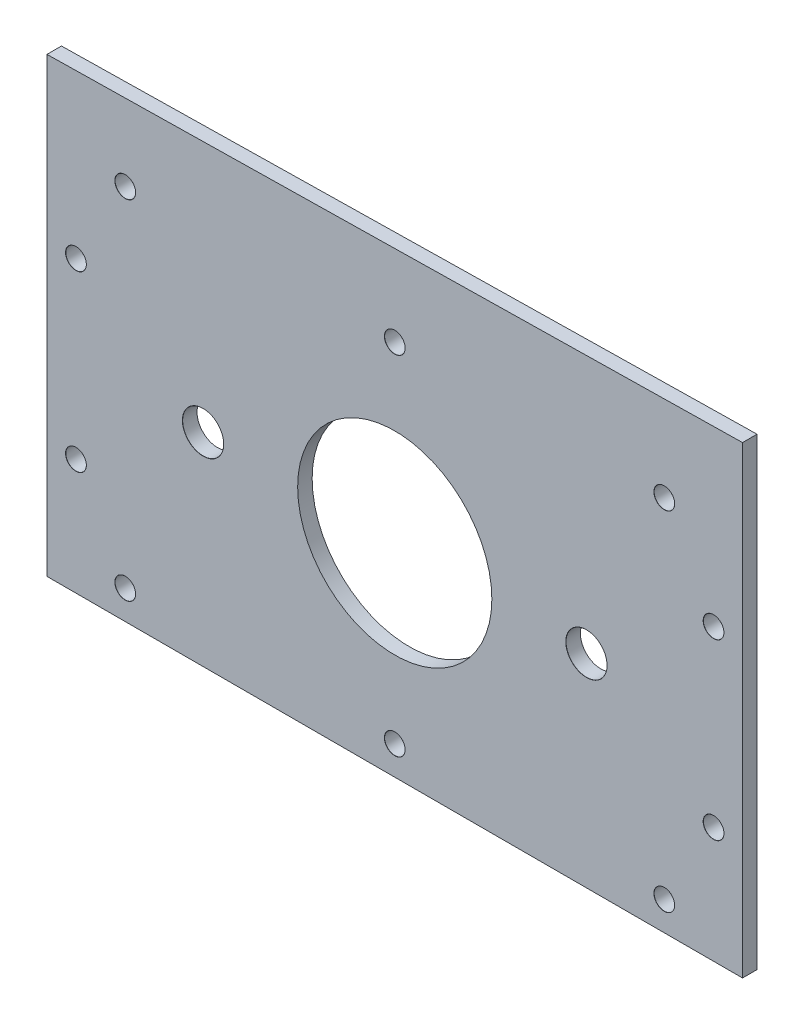
ISO-10303-21;
HEADER;
FILE_DESCRIPTION(('STEP AP214'),'2;1');
FILE_NAME('part.step','',(''),(''),'','','');
FILE_SCHEMA(('AUTOMOTIVE_DESIGN { 1 0 10303 214 1 1 1 1 }'));
ENDSEC;
DATA;
#1=APPLICATION_CONTEXT('core data for automotive mechanical design processes');
#2=APPLICATION_PROTOCOL_DEFINITION('international standard','automotive_design',2000,#1);
#3=PRODUCT_CONTEXT('',#1,'mechanical');
#4=PRODUCT('Part','Part','',(#3));
#5=PRODUCT_RELATED_PRODUCT_CATEGORY('part','',(#4));
#6=PRODUCT_DEFINITION_FORMATION('','',#4);
#7=PRODUCT_DEFINITION_CONTEXT('part definition',#1,'design');
#8=PRODUCT_DEFINITION('design','',#6,#7);
#9=PRODUCT_DEFINITION_SHAPE('','',#8);
#10=(LENGTH_UNIT() NAMED_UNIT(*) SI_UNIT(.MILLI.,.METRE.));
#11=(NAMED_UNIT(*) PLANE_ANGLE_UNIT() SI_UNIT($,.RADIAN.));
#12=(NAMED_UNIT(*) SI_UNIT($,.STERADIAN.) SOLID_ANGLE_UNIT());
#13=UNCERTAINTY_MEASURE_WITH_UNIT(LENGTH_MEASURE(1.E-05),#10,'distance_accuracy_value','');
#14=(GEOMETRIC_REPRESENTATION_CONTEXT(3) GLOBAL_UNCERTAINTY_ASSIGNED_CONTEXT((#13)) GLOBAL_UNIT_ASSIGNED_CONTEXT((#10,
#11,#12)) REPRESENTATION_CONTEXT('',''));
#15=CARTESIAN_POINT('',(0.,0.,0.));
#16=DIRECTION('',(0.,0.,1.));
#17=DIRECTION('',(1.,0.,0.));
#18=AXIS2_PLACEMENT_3D('',#15,#16,#17);
#19=CARTESIAN_POINT('',(76.2,44.45,3.175));
#20=DIRECTION('',(-1.,0.,0.));
#21=DIRECTION('',(0.,0.,1.));
#22=AXIS2_PLACEMENT_3D('',#19,#20,#21);
#23=PLANE('',#22);
#24=DIRECTION('',(0.,1.,0.));
#25=VECTOR('',#24,1.);
#26=CARTESIAN_POINT('',(76.2,44.45,0.));
#27=LINE('',#26,#25);
#28=CARTESIAN_POINT('',(76.2,-44.45,0.));
#29=VERTEX_POINT('',#28);
#30=CARTESIAN_POINT('',(76.2,57.15,0.));
#31=VERTEX_POINT('',#30);
#32=EDGE_CURVE('E73',#29,#31,#27,.T.);
#33=ORIENTED_EDGE('',*,*,#32,.T.);
#34=DIRECTION('',(0.,0.,-1.));
#35=VECTOR('',#34,1.);
#36=CARTESIAN_POINT('',(76.2,57.15,3.175));
#37=LINE('',#36,#35);
#38=CARTESIAN_POINT('',(76.2,57.15,3.175));
#39=VERTEX_POINT('',#38);
#40=EDGE_CURVE('E11',#39,#31,#37,.T.);
#41=ORIENTED_EDGE('',*,*,#40,.F.);
#42=DIRECTION('',(0.,1.,0.));
#43=VECTOR('',#42,1.);
#44=CARTESIAN_POINT('',(76.2,44.45,3.175));
#45=LINE('',#44,#43);
#46=CARTESIAN_POINT('',(76.2,-44.45,3.175));
#47=VERTEX_POINT('',#46);
#48=EDGE_CURVE('E78',#47,#39,#45,.T.);
#49=ORIENTED_EDGE('',*,*,#48,.F.);
#50=DIRECTION('',(0.,0.,-1.));
#51=VECTOR('',#50,1.);
#52=CARTESIAN_POINT('',(76.2,-44.45,3.175));
#53=LINE('',#52,#51);
#54=EDGE_CURVE('E94',#47,#29,#53,.T.);
#55=ORIENTED_EDGE('',*,*,#54,.T.);
#56=EDGE_LOOP('',(#33,#41,#49,#55));
#57=FACE_BOUND('',#56,.T.);
#58=ADVANCED_FACE('F34',(#57),#23,.F.);
#59=CARTESIAN_POINT('',(-76.2,54.61,3.175));
#60=DIRECTION('',(0.0166643523339933,-0.9998611400396,0.));
#61=DIRECTION('',(0.9998611400396,0.0166643523339933,0.));
#62=AXIS2_PLACEMENT_3D('',#59,#60,#61);
#63=PLANE('',#62);
#64=DIRECTION('',(-0.9998611400396,-0.0166643523339933,0.));
#65=VECTOR('',#64,1.);
#66=CARTESIAN_POINT('',(-76.2,54.61,0.));
#67=LINE('',#66,#65);
#68=CARTESIAN_POINT('',(-76.2,54.61,0.));
#69=VERTEX_POINT('',#68);
#70=EDGE_CURVE('E90',#31,#69,#67,.T.);
#71=ORIENTED_EDGE('',*,*,#70,.T.);
#72=DIRECTION('',(0.,0.,-1.));
#73=VECTOR('',#72,1.);
#74=CARTESIAN_POINT('',(-76.2,54.61,3.175));
#75=LINE('',#74,#73);
#76=CARTESIAN_POINT('',(-76.2,54.61,3.175));
#77=VERTEX_POINT('',#76);
#78=EDGE_CURVE('E42',#77,#69,#75,.T.);
#79=ORIENTED_EDGE('',*,*,#78,.F.);
#80=DIRECTION('',(-0.9998611400396,-0.0166643523339933,0.));
#81=VECTOR('',#80,1.);
#82=CARTESIAN_POINT('',(-76.2,54.61,3.175));
#83=LINE('',#82,#81);
#84=EDGE_CURVE('E81',#39,#77,#83,.T.);
#85=ORIENTED_EDGE('',*,*,#84,.F.);
#86=ORIENTED_EDGE('',*,*,#40,.T.);
#87=EDGE_LOOP('',(#71,#79,#85,#86));
#88=FACE_BOUND('',#87,.T.);
#89=ADVANCED_FACE('F89',(#88),#63,.F.);
#90=CARTESIAN_POINT('',(-76.2,44.45,3.175));
#91=DIRECTION('',(1.,0.,0.));
#92=DIRECTION('',(0.,0.,-1.));
#93=AXIS2_PLACEMENT_3D('',#90,#91,#92);
#94=PLANE('',#93);
#95=DIRECTION('',(0.,-1.,0.));
#96=VECTOR('',#95,1.);
#97=CARTESIAN_POINT('',(-76.2,44.45,0.));
#98=LINE('',#97,#96);
#99=CARTESIAN_POINT('',(-76.2,-44.45,0.));
#100=VERTEX_POINT('',#99);
#101=EDGE_CURVE('E66',#69,#100,#98,.T.);
#102=ORIENTED_EDGE('',*,*,#101,.T.);
#103=DIRECTION('',(0.,0.,-1.));
#104=VECTOR('',#103,1.);
#105=CARTESIAN_POINT('',(-76.2,-44.45,3.175));
#106=LINE('',#105,#104);
#107=CARTESIAN_POINT('',(-76.2,-44.45,3.175));
#108=VERTEX_POINT('',#107);
#109=EDGE_CURVE('E91',#108,#100,#106,.T.);
#110=ORIENTED_EDGE('',*,*,#109,.F.);
#111=DIRECTION('',(0.,-1.,0.));
#112=VECTOR('',#111,1.);
#113=CARTESIAN_POINT('',(-76.2,54.61,3.175));
#114=LINE('',#113,#112);
#115=EDGE_CURVE('E85',#77,#108,#114,.T.);
#116=ORIENTED_EDGE('',*,*,#115,.F.);
#117=ORIENTED_EDGE('',*,*,#78,.T.);
#118=EDGE_LOOP('',(#102,#110,#116,#117));
#119=FACE_BOUND('',#118,.T.);
#120=ADVANCED_FACE('F92',(#119),#94,.F.);
#121=CARTESIAN_POINT('',(-76.2,-44.45,3.175));
#122=DIRECTION('',(0.,1.,0.));
#123=DIRECTION('',(0.,0.,1.));
#124=AXIS2_PLACEMENT_3D('',#121,#122,#123);
#125=PLANE('',#124);
#126=DIRECTION('',(1.,0.,0.));
#127=VECTOR('',#126,1.);
#128=CARTESIAN_POINT('',(-76.2,-44.45,0.));
#129=LINE('',#128,#127);
#130=EDGE_CURVE('E102',#100,#29,#129,.T.);
#131=ORIENTED_EDGE('',*,*,#130,.T.);
#132=ORIENTED_EDGE('',*,*,#54,.F.);
#133=DIRECTION('',(1.,0.,0.));
#134=VECTOR('',#133,1.);
#135=CARTESIAN_POINT('',(-76.2,-44.45,3.175));
#136=LINE('',#135,#134);
#137=EDGE_CURVE('E50',#108,#47,#136,.T.);
#138=ORIENTED_EDGE('',*,*,#137,.F.);
#139=ORIENTED_EDGE('',*,*,#109,.T.);
#140=EDGE_LOOP('',(#131,#132,#138,#139));
#141=FACE_BOUND('',#140,.T.);
#142=ADVANCED_FACE('F107',(#141),#125,.F.);
#143=CARTESIAN_POINT('',(0.,0.,3.175));
#144=DIRECTION('',(0.,0.,1.));
#145=DIRECTION('',(1.,0.,0.));
#146=AXIS2_PLACEMENT_3D('',#143,#144,#145);
#147=PLANE('',#146);
#148=CARTESIAN_POINT('',(0.,0.,3.175));
#149=DIRECTION('',(0.,0.,1.));
#150=DIRECTION('',(1.,0.,0.));
#151=AXIS2_PLACEMENT_3D('',#148,#149,#150);
#152=CIRCLE('',#151,21.275);
#153=CARTESIAN_POINT('',(21.275,0.,3.175));
#154=VERTEX_POINT('',#153);
#155=EDGE_CURVE('E239',#154,#154,#152,.T.);
#156=ORIENTED_EDGE('',*,*,#155,.F.);
#157=EDGE_LOOP('',(#156));
#158=FACE_BOUND('',#157,.T.);
#159=CARTESIAN_POINT('',(-42.,0.,3.175));
#160=DIRECTION('',(0.,0.,1.));
#161=DIRECTION('',(1.,0.,0.));
#162=AXIS2_PLACEMENT_3D('',#159,#160,#161);
#163=CIRCLE('',#162,4.525);
#164=CARTESIAN_POINT('',(-37.475,0.,3.175));
#165=VERTEX_POINT('',#164);
#166=EDGE_CURVE('E235',#165,#165,#163,.T.);
#167=ORIENTED_EDGE('',*,*,#166,.F.);
#168=EDGE_LOOP('',(#167));
#169=FACE_BOUND('',#168,.T.);
#170=CARTESIAN_POINT('',(42.,0.,3.175));
#171=DIRECTION('',(0.,0.,1.));
#172=DIRECTION('',(1.,0.,0.));
#173=AXIS2_PLACEMENT_3D('',#170,#171,#172);
#174=CIRCLE('',#173,4.525);
#175=CARTESIAN_POINT('',(46.525,0.,3.175));
#176=VERTEX_POINT('',#175);
#177=EDGE_CURVE('E226',#176,#176,#174,.T.);
#178=ORIENTED_EDGE('',*,*,#177,.F.);
#179=EDGE_LOOP('',(#178));
#180=FACE_BOUND('',#179,.T.);
#181=CARTESIAN_POINT('',(-59.055,38.1,3.175));
#182=DIRECTION('',(0.,0.,1.));
#183=DIRECTION('',(1.,0.,0.));
#184=AXIS2_PLACEMENT_3D('',#181,#182,#183);
#185=CIRCLE('',#184,2.275);
#186=CARTESIAN_POINT('',(-56.78,38.1,3.175));
#187=VERTEX_POINT('',#186);
#188=EDGE_CURVE('E217',#187,#187,#185,.T.);
#189=ORIENTED_EDGE('',*,*,#188,.F.);
#190=EDGE_LOOP('',(#189));
#191=FACE_BOUND('',#190,.T.);
#192=CARTESIAN_POINT('',(0.,38.1,3.175));
#193=DIRECTION('',(0.,0.,1.));
#194=DIRECTION('',(1.,0.,0.));
#195=AXIS2_PLACEMENT_3D('',#192,#193,#194);
#196=CIRCLE('',#195,2.275);
#197=CARTESIAN_POINT('',(2.275,38.1,3.175));
#198=VERTEX_POINT('',#197);
#199=EDGE_CURVE('E208',#198,#198,#196,.T.);
#200=ORIENTED_EDGE('',*,*,#199,.F.);
#201=EDGE_LOOP('',(#200));
#202=FACE_BOUND('',#201,.T.);
#203=CARTESIAN_POINT('',(59.055,38.1,3.175));
#204=DIRECTION('',(0.,0.,1.));
#205=DIRECTION('',(1.,0.,0.));
#206=AXIS2_PLACEMENT_3D('',#203,#204,#205);
#207=CIRCLE('',#206,2.275);
#208=CARTESIAN_POINT('',(61.33,38.1,3.175));
#209=VERTEX_POINT('',#208);
#210=EDGE_CURVE('E199',#209,#209,#207,.T.);
#211=ORIENTED_EDGE('',*,*,#210,.F.);
#212=EDGE_LOOP('',(#211));
#213=FACE_BOUND('',#212,.T.);
#214=CARTESIAN_POINT('',(69.85,19.05,3.175));
#215=DIRECTION('',(0.,0.,1.));
#216=DIRECTION('',(1.,0.,0.));
#217=AXIS2_PLACEMENT_3D('',#214,#215,#216);
#218=CIRCLE('',#217,2.275);
#219=CARTESIAN_POINT('',(72.125,19.05,3.175));
#220=VERTEX_POINT('',#219);
#221=EDGE_CURVE('E190',#220,#220,#218,.T.);
#222=ORIENTED_EDGE('',*,*,#221,.F.);
#223=EDGE_LOOP('',(#222));
#224=FACE_BOUND('',#223,.T.);
#225=CARTESIAN_POINT('',(69.85,-19.05,3.175));
#226=DIRECTION('',(0.,0.,1.));
#227=DIRECTION('',(1.,0.,0.));
#228=AXIS2_PLACEMENT_3D('',#225,#226,#227);
#229=CIRCLE('',#228,2.275);
#230=CARTESIAN_POINT('',(72.125,-19.05,3.175));
#231=VERTEX_POINT('',#230);
#232=EDGE_CURVE('E181',#231,#231,#229,.T.);
#233=ORIENTED_EDGE('',*,*,#232,.F.);
#234=EDGE_LOOP('',(#233));
#235=FACE_BOUND('',#234,.T.);
#236=CARTESIAN_POINT('',(59.055,-38.1,3.175));
#237=DIRECTION('',(0.,0.,1.));
#238=DIRECTION('',(1.,0.,0.));
#239=AXIS2_PLACEMENT_3D('',#236,#237,#238);
#240=CIRCLE('',#239,2.275);
#241=CARTESIAN_POINT('',(61.33,-38.1,3.175));
#242=VERTEX_POINT('',#241);
#243=EDGE_CURVE('E172',#242,#242,#240,.T.);
#244=ORIENTED_EDGE('',*,*,#243,.F.);
#245=EDGE_LOOP('',(#244));
#246=FACE_BOUND('',#245,.T.);
#247=CARTESIAN_POINT('',(0.,-38.1,3.175));
#248=DIRECTION('',(0.,0.,1.));
#249=DIRECTION('',(1.,0.,0.));
#250=AXIS2_PLACEMENT_3D('',#247,#248,#249);
#251=CIRCLE('',#250,2.275);
#252=CARTESIAN_POINT('',(2.27500000000003,-38.1,3.175));
#253=VERTEX_POINT('',#252);
#254=EDGE_CURVE('E163',#253,#253,#251,.T.);
#255=ORIENTED_EDGE('',*,*,#254,.F.);
#256=EDGE_LOOP('',(#255));
#257=FACE_BOUND('',#256,.T.);
#258=CARTESIAN_POINT('',(-59.055,-38.1,3.175));
#259=DIRECTION('',(0.,0.,1.));
#260=DIRECTION('',(1.,0.,0.));
#261=AXIS2_PLACEMENT_3D('',#258,#259,#260);
#262=CIRCLE('',#261,2.275);
#263=CARTESIAN_POINT('',(-56.78,-38.1,3.175));
#264=VERTEX_POINT('',#263);
#265=EDGE_CURVE('E154',#264,#264,#262,.T.);
#266=ORIENTED_EDGE('',*,*,#265,.F.);
#267=EDGE_LOOP('',(#266));
#268=FACE_BOUND('',#267,.T.);
#269=CARTESIAN_POINT('',(-69.85,-19.05,3.175));
#270=DIRECTION('',(0.,0.,1.));
#271=DIRECTION('',(1.,0.,0.));
#272=AXIS2_PLACEMENT_3D('',#269,#270,#271);
#273=CIRCLE('',#272,2.275);
#274=CARTESIAN_POINT('',(-67.575,-19.05,3.175));
#275=VERTEX_POINT('',#274);
#276=EDGE_CURVE('E145',#275,#275,#273,.T.);
#277=ORIENTED_EDGE('',*,*,#276,.F.);
#278=EDGE_LOOP('',(#277));
#279=FACE_BOUND('',#278,.T.);
#280=CARTESIAN_POINT('',(-69.85,19.05,3.175));
#281=DIRECTION('',(0.,0.,1.));
#282=DIRECTION('',(1.,0.,0.));
#283=AXIS2_PLACEMENT_3D('',#280,#281,#282);
#284=CIRCLE('',#283,2.275);
#285=CARTESIAN_POINT('',(-67.575,19.05,3.175));
#286=VERTEX_POINT('',#285);
#287=EDGE_CURVE('E136',#286,#286,#284,.T.);
#288=ORIENTED_EDGE('',*,*,#287,.F.);
#289=EDGE_LOOP('',(#288));
#290=FACE_BOUND('',#289,.T.);
#291=ORIENTED_EDGE('',*,*,#48,.T.);
#292=ORIENTED_EDGE('',*,*,#84,.T.);
#293=ORIENTED_EDGE('',*,*,#115,.T.);
#294=ORIENTED_EDGE('',*,*,#137,.T.);
#295=EDGE_LOOP('',(#291,#292,#293,#294));
#296=FACE_BOUND('',#295,.T.);
#297=ADVANCED_FACE('F83',(#158,#169,#180,#191,#202,#213,#224,#235,#246,#257,#268,#279,#290,
#296),#147,.T.);
#298=CARTESIAN_POINT('',(0.,0.,0.));
#299=DIRECTION('',(0.,0.,1.));
#300=DIRECTION('',(1.,0.,0.));
#301=AXIS2_PLACEMENT_3D('',#298,#299,#300);
#302=PLANE('',#301);
#303=CARTESIAN_POINT('',(0.,0.,0.));
#304=DIRECTION('',(0.,0.,1.));
#305=DIRECTION('',(1.,0.,0.));
#306=AXIS2_PLACEMENT_3D('',#303,#304,#305);
#307=CIRCLE('',#306,21.275);
#308=CARTESIAN_POINT('',(21.275,0.,0.));
#309=VERTEX_POINT('',#308);
#310=EDGE_CURVE('E238',#309,#309,#307,.T.);
#311=ORIENTED_EDGE('',*,*,#310,.T.);
#312=EDGE_LOOP('',(#311));
#313=FACE_BOUND('',#312,.T.);
#314=CARTESIAN_POINT('',(-42.,0.,0.));
#315=DIRECTION('',(0.,0.,1.));
#316=DIRECTION('',(1.,0.,0.));
#317=AXIS2_PLACEMENT_3D('',#314,#315,#316);
#318=CIRCLE('',#317,4.5);
#319=CARTESIAN_POINT('',(-37.5,0.,0.));
#320=VERTEX_POINT('',#319);
#321=EDGE_CURVE('E229',#320,#320,#318,.T.);
#322=ORIENTED_EDGE('',*,*,#321,.T.);
#323=EDGE_LOOP('',(#322));
#324=FACE_BOUND('',#323,.T.);
#325=CARTESIAN_POINT('',(42.,0.,0.));
#326=DIRECTION('',(0.,0.,1.));
#327=DIRECTION('',(1.,0.,0.));
#328=AXIS2_PLACEMENT_3D('',#325,#326,#327);
#329=CIRCLE('',#328,4.5);
#330=CARTESIAN_POINT('',(46.5,0.,0.));
#331=VERTEX_POINT('',#330);
#332=EDGE_CURVE('E220',#331,#331,#329,.T.);
#333=ORIENTED_EDGE('',*,*,#332,.T.);
#334=EDGE_LOOP('',(#333));
#335=FACE_BOUND('',#334,.T.);
#336=CARTESIAN_POINT('',(-59.055,38.1,0.));
#337=DIRECTION('',(0.,0.,1.));
#338=DIRECTION('',(1.,0.,0.));
#339=AXIS2_PLACEMENT_3D('',#336,#337,#338);
#340=CIRCLE('',#339,2.25);
#341=CARTESIAN_POINT('',(-56.805,38.1,0.));
#342=VERTEX_POINT('',#341);
#343=EDGE_CURVE('E211',#342,#342,#340,.T.);
#344=ORIENTED_EDGE('',*,*,#343,.T.);
#345=EDGE_LOOP('',(#344));
#346=FACE_BOUND('',#345,.T.);
#347=CARTESIAN_POINT('',(0.,38.1,0.));
#348=DIRECTION('',(0.,0.,1.));
#349=DIRECTION('',(1.,0.,0.));
#350=AXIS2_PLACEMENT_3D('',#347,#348,#349);
#351=CIRCLE('',#350,2.25);
#352=CARTESIAN_POINT('',(2.25,38.1,0.));
#353=VERTEX_POINT('',#352);
#354=EDGE_CURVE('E202',#353,#353,#351,.T.);
#355=ORIENTED_EDGE('',*,*,#354,.T.);
#356=EDGE_LOOP('',(#355));
#357=FACE_BOUND('',#356,.T.);
#358=CARTESIAN_POINT('',(59.055,38.1,0.));
#359=DIRECTION('',(0.,0.,1.));
#360=DIRECTION('',(1.,0.,0.));
#361=AXIS2_PLACEMENT_3D('',#358,#359,#360);
#362=CIRCLE('',#361,2.25);
#363=CARTESIAN_POINT('',(61.305,38.1,0.));
#364=VERTEX_POINT('',#363);
#365=EDGE_CURVE('E193',#364,#364,#362,.T.);
#366=ORIENTED_EDGE('',*,*,#365,.T.);
#367=EDGE_LOOP('',(#366));
#368=FACE_BOUND('',#367,.T.);
#369=CARTESIAN_POINT('',(69.85,19.05,0.));
#370=DIRECTION('',(0.,0.,1.));
#371=DIRECTION('',(1.,0.,0.));
#372=AXIS2_PLACEMENT_3D('',#369,#370,#371);
#373=CIRCLE('',#372,2.25);
#374=CARTESIAN_POINT('',(72.1,19.05,0.));
#375=VERTEX_POINT('',#374);
#376=EDGE_CURVE('E184',#375,#375,#373,.T.);
#377=ORIENTED_EDGE('',*,*,#376,.T.);
#378=EDGE_LOOP('',(#377));
#379=FACE_BOUND('',#378,.T.);
#380=CARTESIAN_POINT('',(69.85,-19.05,0.));
#381=DIRECTION('',(0.,0.,1.));
#382=DIRECTION('',(1.,0.,0.));
#383=AXIS2_PLACEMENT_3D('',#380,#381,#382);
#384=CIRCLE('',#383,2.25);
#385=CARTESIAN_POINT('',(72.1,-19.05,0.));
#386=VERTEX_POINT('',#385);
#387=EDGE_CURVE('E175',#386,#386,#384,.T.);
#388=ORIENTED_EDGE('',*,*,#387,.T.);
#389=EDGE_LOOP('',(#388));
#390=FACE_BOUND('',#389,.T.);
#391=CARTESIAN_POINT('',(59.055,-38.1,0.));
#392=DIRECTION('',(0.,0.,1.));
#393=DIRECTION('',(1.,0.,0.));
#394=AXIS2_PLACEMENT_3D('',#391,#392,#393);
#395=CIRCLE('',#394,2.25);
#396=CARTESIAN_POINT('',(61.305,-38.1,0.));
#397=VERTEX_POINT('',#396);
#398=EDGE_CURVE('E166',#397,#397,#395,.T.);
#399=ORIENTED_EDGE('',*,*,#398,.T.);
#400=EDGE_LOOP('',(#399));
#401=FACE_BOUND('',#400,.T.);
#402=CARTESIAN_POINT('',(0.,-38.1,0.));
#403=DIRECTION('',(0.,0.,1.));
#404=DIRECTION('',(1.,0.,0.));
#405=AXIS2_PLACEMENT_3D('',#402,#403,#404);
#406=CIRCLE('',#405,2.25);
#407=CARTESIAN_POINT('',(2.25000000000003,-38.1,0.));
#408=VERTEX_POINT('',#407);
#409=EDGE_CURVE('E157',#408,#408,#406,.T.);
#410=ORIENTED_EDGE('',*,*,#409,.T.);
#411=EDGE_LOOP('',(#410));
#412=FACE_BOUND('',#411,.T.);
#413=CARTESIAN_POINT('',(-59.055,-38.1,0.));
#414=DIRECTION('',(0.,0.,1.));
#415=DIRECTION('',(1.,0.,0.));
#416=AXIS2_PLACEMENT_3D('',#413,#414,#415);
#417=CIRCLE('',#416,2.25);
#418=CARTESIAN_POINT('',(-56.805,-38.1,0.));
#419=VERTEX_POINT('',#418);
#420=EDGE_CURVE('E148',#419,#419,#417,.T.);
#421=ORIENTED_EDGE('',*,*,#420,.T.);
#422=EDGE_LOOP('',(#421));
#423=FACE_BOUND('',#422,.T.);
#424=CARTESIAN_POINT('',(-69.85,-19.05,0.));
#425=DIRECTION('',(0.,0.,1.));
#426=DIRECTION('',(1.,0.,0.));
#427=AXIS2_PLACEMENT_3D('',#424,#425,#426);
#428=CIRCLE('',#427,2.25);
#429=CARTESIAN_POINT('',(-67.6,-19.05,0.));
#430=VERTEX_POINT('',#429);
#431=EDGE_CURVE('E139',#430,#430,#428,.T.);
#432=ORIENTED_EDGE('',*,*,#431,.T.);
#433=EDGE_LOOP('',(#432));
#434=FACE_BOUND('',#433,.T.);
#435=CARTESIAN_POINT('',(-69.85,19.05,0.));
#436=DIRECTION('',(0.,0.,1.));
#437=DIRECTION('',(1.,0.,0.));
#438=AXIS2_PLACEMENT_3D('',#435,#436,#437);
#439=CIRCLE('',#438,2.25);
#440=CARTESIAN_POINT('',(-67.6,19.05,0.));
#441=VERTEX_POINT('',#440);
#442=EDGE_CURVE('E99',#441,#441,#439,.T.);
#443=ORIENTED_EDGE('',*,*,#442,.T.);
#444=EDGE_LOOP('',(#443));
#445=FACE_BOUND('',#444,.T.);
#446=ORIENTED_EDGE('',*,*,#32,.F.);
#447=ORIENTED_EDGE('',*,*,#130,.F.);
#448=ORIENTED_EDGE('',*,*,#101,.F.);
#449=ORIENTED_EDGE('',*,*,#70,.F.);
#450=EDGE_LOOP('',(#446,#447,#448,#449));
#451=FACE_BOUND('',#450,.T.);
#452=ADVANCED_FACE('F108',(#313,#324,#335,#346,#357,#368,#379,#390,#401,#412,#423,#434,#445,
#451),#302,.F.);
#453=CARTESIAN_POINT('',(-69.85,19.05,3.175));
#454=DIRECTION('',(0.,0.,1.));
#455=DIRECTION('',(1.,0.,0.));
#456=AXIS2_PLACEMENT_3D('',#453,#454,#455);
#457=CYLINDRICAL_SURFACE('',#456,2.25);
#458=ORIENTED_EDGE('',*,*,#442,.F.);
#459=EDGE_LOOP('',(#458));
#460=FACE_BOUND('',#459,.T.);
#461=CARTESIAN_POINT('',(-69.85,19.05,3.15));
#462=DIRECTION('',(0.,0.,1.));
#463=DIRECTION('',(1.,0.,0.));
#464=AXIS2_PLACEMENT_3D('',#461,#462,#463);
#465=CIRCLE('',#464,2.25);
#466=CARTESIAN_POINT('',(-67.6,19.05,3.15));
#467=VERTEX_POINT('',#466);
#468=EDGE_CURVE('E133',#467,#467,#465,.T.);
#469=ORIENTED_EDGE('',*,*,#468,.T.);
#470=EDGE_LOOP('',(#469));
#471=FACE_BOUND('',#470,.T.);
#472=ADVANCED_FACE('F110',(#460,#471),#457,.F.);
#473=CARTESIAN_POINT('',(-69.85,19.05,3.175));
#474=DIRECTION('',(0.,0.,1.));
#475=DIRECTION('',(1.,0.,0.));
#476=AXIS2_PLACEMENT_3D('',#473,#474,#475);
#477=CONICAL_SURFACE('',#476,2.275,0.785398163397353);
#478=ORIENTED_EDGE('',*,*,#468,.F.);
#479=EDGE_LOOP('',(#478));
#480=FACE_BOUND('',#479,.T.);
#481=ORIENTED_EDGE('',*,*,#287,.T.);
#482=EDGE_LOOP('',(#481));
#483=FACE_BOUND('',#482,.T.);
#484=ADVANCED_FACE('F117',(#480,#483),#477,.F.);
#485=CARTESIAN_POINT('',(-69.85,-19.05,3.175));
#486=DIRECTION('',(0.,0.,1.));
#487=DIRECTION('',(1.,0.,0.));
#488=AXIS2_PLACEMENT_3D('',#485,#486,#487);
#489=CYLINDRICAL_SURFACE('',#488,2.25);
#490=ORIENTED_EDGE('',*,*,#431,.F.);
#491=EDGE_LOOP('',(#490));
#492=FACE_BOUND('',#491,.T.);
#493=CARTESIAN_POINT('',(-69.85,-19.05,3.15));
#494=DIRECTION('',(0.,0.,1.));
#495=DIRECTION('',(1.,0.,0.));
#496=AXIS2_PLACEMENT_3D('',#493,#494,#495);
#497=CIRCLE('',#496,2.25);
#498=CARTESIAN_POINT('',(-67.6,-19.05,3.15));
#499=VERTEX_POINT('',#498);
#500=EDGE_CURVE('E142',#499,#499,#497,.T.);
#501=ORIENTED_EDGE('',*,*,#500,.T.);
#502=EDGE_LOOP('',(#501));
#503=FACE_BOUND('',#502,.T.);
#504=ADVANCED_FACE('F276',(#492,#503),#489,.F.);
#505=CARTESIAN_POINT('',(-69.85,-19.05,3.175));
#506=DIRECTION('',(0.,0.,1.));
#507=DIRECTION('',(1.,0.,0.));
#508=AXIS2_PLACEMENT_3D('',#505,#506,#507);
#509=CONICAL_SURFACE('',#508,2.275,0.785398163397353);
#510=ORIENTED_EDGE('',*,*,#500,.F.);
#511=EDGE_LOOP('',(#510));
#512=FACE_BOUND('',#511,.T.);
#513=ORIENTED_EDGE('',*,*,#276,.T.);
#514=EDGE_LOOP('',(#513));
#515=FACE_BOUND('',#514,.T.);
#516=ADVANCED_FACE('F282',(#512,#515),#509,.F.);
#517=CARTESIAN_POINT('',(-59.055,-38.1,3.175));
#518=DIRECTION('',(0.,0.,1.));
#519=DIRECTION('',(1.,0.,0.));
#520=AXIS2_PLACEMENT_3D('',#517,#518,#519);
#521=CYLINDRICAL_SURFACE('',#520,2.25);
#522=ORIENTED_EDGE('',*,*,#420,.F.);
#523=EDGE_LOOP('',(#522));
#524=FACE_BOUND('',#523,.T.);
#525=CARTESIAN_POINT('',(-59.055,-38.1,3.15));
#526=DIRECTION('',(0.,0.,1.));
#527=DIRECTION('',(1.,0.,0.));
#528=AXIS2_PLACEMENT_3D('',#525,#526,#527);
#529=CIRCLE('',#528,2.25);
#530=CARTESIAN_POINT('',(-56.805,-38.1,3.15));
#531=VERTEX_POINT('',#530);
#532=EDGE_CURVE('E151',#531,#531,#529,.T.);
#533=ORIENTED_EDGE('',*,*,#532,.T.);
#534=EDGE_LOOP('',(#533));
#535=FACE_BOUND('',#534,.T.);
#536=ADVANCED_FACE('F289',(#524,#535),#521,.F.);
#537=CARTESIAN_POINT('',(-59.055,-38.1,3.175));
#538=DIRECTION('',(0.,0.,1.));
#539=DIRECTION('',(1.,0.,0.));
#540=AXIS2_PLACEMENT_3D('',#537,#538,#539);
#541=CONICAL_SURFACE('',#540,2.275,0.785398163397353);
#542=ORIENTED_EDGE('',*,*,#532,.F.);
#543=EDGE_LOOP('',(#542));
#544=FACE_BOUND('',#543,.T.);
#545=ORIENTED_EDGE('',*,*,#265,.T.);
#546=EDGE_LOOP('',(#545));
#547=FACE_BOUND('',#546,.T.);
#548=ADVANCED_FACE('F293',(#544,#547),#541,.F.);
#549=CARTESIAN_POINT('',(0.,-38.1,3.175));
#550=DIRECTION('',(0.,0.,1.));
#551=DIRECTION('',(1.,0.,0.));
#552=AXIS2_PLACEMENT_3D('',#549,#550,#551);
#553=CYLINDRICAL_SURFACE('',#552,2.25);
#554=ORIENTED_EDGE('',*,*,#409,.F.);
#555=EDGE_LOOP('',(#554));
#556=FACE_BOUND('',#555,.T.);
#557=CARTESIAN_POINT('',(0.,-38.1,3.15));
#558=DIRECTION('',(0.,0.,1.));
#559=DIRECTION('',(1.,0.,0.));
#560=AXIS2_PLACEMENT_3D('',#557,#558,#559);
#561=CIRCLE('',#560,2.25);
#562=CARTESIAN_POINT('',(2.25000000000003,-38.1,3.15));
#563=VERTEX_POINT('',#562);
#564=EDGE_CURVE('E160',#563,#563,#561,.T.);
#565=ORIENTED_EDGE('',*,*,#564,.T.);
#566=EDGE_LOOP('',(#565));
#567=FACE_BOUND('',#566,.T.);
#568=ADVANCED_FACE('F297',(#556,#567),#553,.F.);
#569=CARTESIAN_POINT('',(0.,-38.1,3.175));
#570=DIRECTION('',(0.,0.,1.));
#571=DIRECTION('',(1.,0.,0.));
#572=AXIS2_PLACEMENT_3D('',#569,#570,#571);
#573=CONICAL_SURFACE('',#572,2.275,0.785398163397396);
#574=ORIENTED_EDGE('',*,*,#564,.F.);
#575=EDGE_LOOP('',(#574));
#576=FACE_BOUND('',#575,.T.);
#577=ORIENTED_EDGE('',*,*,#254,.T.);
#578=EDGE_LOOP('',(#577));
#579=FACE_BOUND('',#578,.T.);
#580=ADVANCED_FACE('F301',(#576,#579),#573,.F.);
#581=CARTESIAN_POINT('',(59.055,-38.1,3.175));
#582=DIRECTION('',(0.,0.,1.));
#583=DIRECTION('',(1.,0.,0.));
#584=AXIS2_PLACEMENT_3D('',#581,#582,#583);
#585=CYLINDRICAL_SURFACE('',#584,2.25);
#586=ORIENTED_EDGE('',*,*,#398,.F.);
#587=EDGE_LOOP('',(#586));
#588=FACE_BOUND('',#587,.T.);
#589=CARTESIAN_POINT('',(59.055,-38.1,3.15));
#590=DIRECTION('',(0.,0.,1.));
#591=DIRECTION('',(1.,0.,0.));
#592=AXIS2_PLACEMENT_3D('',#589,#590,#591);
#593=CIRCLE('',#592,2.25);
#594=CARTESIAN_POINT('',(61.305,-38.1,3.15));
#595=VERTEX_POINT('',#594);
#596=EDGE_CURVE('E169',#595,#595,#593,.T.);
#597=ORIENTED_EDGE('',*,*,#596,.T.);
#598=EDGE_LOOP('',(#597));
#599=FACE_BOUND('',#598,.T.);
#600=ADVANCED_FACE('F305',(#588,#599),#585,.F.);
#601=CARTESIAN_POINT('',(59.055,-38.1,3.175));
#602=DIRECTION('',(0.,0.,1.));
#603=DIRECTION('',(1.,0.,0.));
#604=AXIS2_PLACEMENT_3D('',#601,#602,#603);
#605=CONICAL_SURFACE('',#604,2.275,0.785398163397353);
#606=ORIENTED_EDGE('',*,*,#596,.F.);
#607=EDGE_LOOP('',(#606));
#608=FACE_BOUND('',#607,.T.);
#609=ORIENTED_EDGE('',*,*,#243,.T.);
#610=EDGE_LOOP('',(#609));
#611=FACE_BOUND('',#610,.T.);
#612=ADVANCED_FACE('F309',(#608,#611),#605,.F.);
#613=CARTESIAN_POINT('',(69.85,-19.05,3.175));
#614=DIRECTION('',(0.,0.,1.));
#615=DIRECTION('',(1.,0.,0.));
#616=AXIS2_PLACEMENT_3D('',#613,#614,#615);
#617=CYLINDRICAL_SURFACE('',#616,2.25);
#618=ORIENTED_EDGE('',*,*,#387,.F.);
#619=EDGE_LOOP('',(#618));
#620=FACE_BOUND('',#619,.T.);
#621=CARTESIAN_POINT('',(69.85,-19.05,3.15));
#622=DIRECTION('',(0.,0.,1.));
#623=DIRECTION('',(1.,0.,0.));
#624=AXIS2_PLACEMENT_3D('',#621,#622,#623);
#625=CIRCLE('',#624,2.25);
#626=CARTESIAN_POINT('',(72.1,-19.05,3.15));
#627=VERTEX_POINT('',#626);
#628=EDGE_CURVE('E178',#627,#627,#625,.T.);
#629=ORIENTED_EDGE('',*,*,#628,.T.);
#630=EDGE_LOOP('',(#629));
#631=FACE_BOUND('',#630,.T.);
#632=ADVANCED_FACE('F313',(#620,#631),#617,.F.);
#633=CARTESIAN_POINT('',(69.85,-19.05,3.175));
#634=DIRECTION('',(0.,0.,1.));
#635=DIRECTION('',(1.,0.,0.));
#636=AXIS2_PLACEMENT_3D('',#633,#634,#635);
#637=CONICAL_SURFACE('',#636,2.275,0.785398163397353);
#638=ORIENTED_EDGE('',*,*,#628,.F.);
#639=EDGE_LOOP('',(#638));
#640=FACE_BOUND('',#639,.T.);
#641=ORIENTED_EDGE('',*,*,#232,.T.);
#642=EDGE_LOOP('',(#641));
#643=FACE_BOUND('',#642,.T.);
#644=ADVANCED_FACE('F317',(#640,#643),#637,.F.);
#645=CARTESIAN_POINT('',(69.85,19.05,3.175));
#646=DIRECTION('',(0.,0.,1.));
#647=DIRECTION('',(1.,0.,0.));
#648=AXIS2_PLACEMENT_3D('',#645,#646,#647);
#649=CYLINDRICAL_SURFACE('',#648,2.25);
#650=ORIENTED_EDGE('',*,*,#376,.F.);
#651=EDGE_LOOP('',(#650));
#652=FACE_BOUND('',#651,.T.);
#653=CARTESIAN_POINT('',(69.85,19.05,3.15));
#654=DIRECTION('',(0.,0.,1.));
#655=DIRECTION('',(1.,0.,0.));
#656=AXIS2_PLACEMENT_3D('',#653,#654,#655);
#657=CIRCLE('',#656,2.25);
#658=CARTESIAN_POINT('',(72.1,19.05,3.15));
#659=VERTEX_POINT('',#658);
#660=EDGE_CURVE('E187',#659,#659,#657,.T.);
#661=ORIENTED_EDGE('',*,*,#660,.T.);
#662=EDGE_LOOP('',(#661));
#663=FACE_BOUND('',#662,.T.);
#664=ADVANCED_FACE('F321',(#652,#663),#649,.F.);
#665=CARTESIAN_POINT('',(69.85,19.05,3.175));
#666=DIRECTION('',(0.,0.,1.));
#667=DIRECTION('',(1.,0.,0.));
#668=AXIS2_PLACEMENT_3D('',#665,#666,#667);
#669=CONICAL_SURFACE('',#668,2.275,0.785398163397353);
#670=ORIENTED_EDGE('',*,*,#660,.F.);
#671=EDGE_LOOP('',(#670));
#672=FACE_BOUND('',#671,.T.);
#673=ORIENTED_EDGE('',*,*,#221,.T.);
#674=EDGE_LOOP('',(#673));
#675=FACE_BOUND('',#674,.T.);
#676=ADVANCED_FACE('F325',(#672,#675),#669,.F.);
#677=CARTESIAN_POINT('',(59.055,38.1,3.175));
#678=DIRECTION('',(0.,0.,1.));
#679=DIRECTION('',(1.,0.,0.));
#680=AXIS2_PLACEMENT_3D('',#677,#678,#679);
#681=CYLINDRICAL_SURFACE('',#680,2.25);
#682=ORIENTED_EDGE('',*,*,#365,.F.);
#683=EDGE_LOOP('',(#682));
#684=FACE_BOUND('',#683,.T.);
#685=CARTESIAN_POINT('',(59.055,38.1,3.15));
#686=DIRECTION('',(0.,0.,1.));
#687=DIRECTION('',(1.,0.,0.));
#688=AXIS2_PLACEMENT_3D('',#685,#686,#687);
#689=CIRCLE('',#688,2.25);
#690=CARTESIAN_POINT('',(61.305,38.1,3.15));
#691=VERTEX_POINT('',#690);
#692=EDGE_CURVE('E196',#691,#691,#689,.T.);
#693=ORIENTED_EDGE('',*,*,#692,.T.);
#694=EDGE_LOOP('',(#693));
#695=FACE_BOUND('',#694,.T.);
#696=ADVANCED_FACE('F329',(#684,#695),#681,.F.);
#697=CARTESIAN_POINT('',(59.055,38.1,3.175));
#698=DIRECTION('',(0.,0.,1.));
#699=DIRECTION('',(1.,0.,0.));
#700=AXIS2_PLACEMENT_3D('',#697,#698,#699);
#701=CONICAL_SURFACE('',#700,2.275,0.785398163397353);
#702=ORIENTED_EDGE('',*,*,#692,.F.);
#703=EDGE_LOOP('',(#702));
#704=FACE_BOUND('',#703,.T.);
#705=ORIENTED_EDGE('',*,*,#210,.T.);
#706=EDGE_LOOP('',(#705));
#707=FACE_BOUND('',#706,.T.);
#708=ADVANCED_FACE('F333',(#704,#707),#701,.F.);
#709=CARTESIAN_POINT('',(0.,38.1,3.175));
#710=DIRECTION('',(0.,0.,1.));
#711=DIRECTION('',(1.,0.,0.));
#712=AXIS2_PLACEMENT_3D('',#709,#710,#711);
#713=CYLINDRICAL_SURFACE('',#712,2.25);
#714=ORIENTED_EDGE('',*,*,#354,.F.);
#715=EDGE_LOOP('',(#714));
#716=FACE_BOUND('',#715,.T.);
#717=CARTESIAN_POINT('',(0.,38.1,3.15));
#718=DIRECTION('',(0.,0.,1.));
#719=DIRECTION('',(1.,0.,0.));
#720=AXIS2_PLACEMENT_3D('',#717,#718,#719);
#721=CIRCLE('',#720,2.25);
#722=CARTESIAN_POINT('',(2.25,38.1,3.15));
#723=VERTEX_POINT('',#722);
#724=EDGE_CURVE('E205',#723,#723,#721,.T.);
#725=ORIENTED_EDGE('',*,*,#724,.T.);
#726=EDGE_LOOP('',(#725));
#727=FACE_BOUND('',#726,.T.);
#728=ADVANCED_FACE('F337',(#716,#727),#713,.F.);
#729=CARTESIAN_POINT('',(0.,38.1,3.175));
#730=DIRECTION('',(0.,0.,1.));
#731=DIRECTION('',(1.,0.,0.));
#732=AXIS2_PLACEMENT_3D('',#729,#730,#731);
#733=CONICAL_SURFACE('',#732,2.275,0.785398163397396);
#734=ORIENTED_EDGE('',*,*,#724,.F.);
#735=EDGE_LOOP('',(#734));
#736=FACE_BOUND('',#735,.T.);
#737=ORIENTED_EDGE('',*,*,#199,.T.);
#738=EDGE_LOOP('',(#737));
#739=FACE_BOUND('',#738,.T.);
#740=ADVANCED_FACE('F341',(#736,#739),#733,.F.);
#741=CARTESIAN_POINT('',(-59.055,38.1,3.175));
#742=DIRECTION('',(0.,0.,1.));
#743=DIRECTION('',(1.,0.,0.));
#744=AXIS2_PLACEMENT_3D('',#741,#742,#743);
#745=CYLINDRICAL_SURFACE('',#744,2.25);
#746=ORIENTED_EDGE('',*,*,#343,.F.);
#747=EDGE_LOOP('',(#746));
#748=FACE_BOUND('',#747,.T.);
#749=CARTESIAN_POINT('',(-59.055,38.1,3.15));
#750=DIRECTION('',(0.,0.,1.));
#751=DIRECTION('',(1.,0.,0.));
#752=AXIS2_PLACEMENT_3D('',#749,#750,#751);
#753=CIRCLE('',#752,2.25);
#754=CARTESIAN_POINT('',(-56.805,38.1,3.15));
#755=VERTEX_POINT('',#754);
#756=EDGE_CURVE('E214',#755,#755,#753,.T.);
#757=ORIENTED_EDGE('',*,*,#756,.T.);
#758=EDGE_LOOP('',(#757));
#759=FACE_BOUND('',#758,.T.);
#760=ADVANCED_FACE('F345',(#748,#759),#745,.F.);
#761=CARTESIAN_POINT('',(-59.055,38.1,3.175));
#762=DIRECTION('',(0.,0.,1.));
#763=DIRECTION('',(1.,0.,0.));
#764=AXIS2_PLACEMENT_3D('',#761,#762,#763);
#765=CONICAL_SURFACE('',#764,2.275,0.785398163397353);
#766=ORIENTED_EDGE('',*,*,#756,.F.);
#767=EDGE_LOOP('',(#766));
#768=FACE_BOUND('',#767,.T.);
#769=ORIENTED_EDGE('',*,*,#188,.T.);
#770=EDGE_LOOP('',(#769));
#771=FACE_BOUND('',#770,.T.);
#772=ADVANCED_FACE('F349',(#768,#771),#765,.F.);
#773=CARTESIAN_POINT('',(42.,0.,3.175));
#774=DIRECTION('',(0.,0.,1.));
#775=DIRECTION('',(1.,0.,0.));
#776=AXIS2_PLACEMENT_3D('',#773,#774,#775);
#777=CYLINDRICAL_SURFACE('',#776,4.5);
#778=ORIENTED_EDGE('',*,*,#332,.F.);
#779=EDGE_LOOP('',(#778));
#780=FACE_BOUND('',#779,.T.);
#781=CARTESIAN_POINT('',(42.,0.,3.15));
#782=DIRECTION('',(0.,0.,1.));
#783=DIRECTION('',(1.,0.,0.));
#784=AXIS2_PLACEMENT_3D('',#781,#782,#783);
#785=CIRCLE('',#784,4.5);
#786=CARTESIAN_POINT('',(46.5,0.,3.15));
#787=VERTEX_POINT('',#786);
#788=EDGE_CURVE('E223',#787,#787,#785,.T.);
#789=ORIENTED_EDGE('',*,*,#788,.T.);
#790=EDGE_LOOP('',(#789));
#791=FACE_BOUND('',#790,.T.);
#792=ADVANCED_FACE('F353',(#780,#791),#777,.F.);
#793=CARTESIAN_POINT('',(42.,0.,3.175));
#794=DIRECTION('',(0.,0.,1.));
#795=DIRECTION('',(1.,0.,0.));
#796=AXIS2_PLACEMENT_3D('',#793,#794,#795);
#797=CONICAL_SURFACE('',#796,4.525,0.7853981633975);
#798=ORIENTED_EDGE('',*,*,#788,.F.);
#799=EDGE_LOOP('',(#798));
#800=FACE_BOUND('',#799,.T.);
#801=ORIENTED_EDGE('',*,*,#177,.T.);
#802=EDGE_LOOP('',(#801));
#803=FACE_BOUND('',#802,.T.);
#804=ADVANCED_FACE('F357',(#800,#803),#797,.F.);
#805=CARTESIAN_POINT('',(-42.,0.,3.175));
#806=DIRECTION('',(0.,0.,1.));
#807=DIRECTION('',(1.,0.,0.));
#808=AXIS2_PLACEMENT_3D('',#805,#806,#807);
#809=CYLINDRICAL_SURFACE('',#808,4.5);
#810=ORIENTED_EDGE('',*,*,#321,.F.);
#811=EDGE_LOOP('',(#810));
#812=FACE_BOUND('',#811,.T.);
#813=CARTESIAN_POINT('',(-42.,0.,3.15));
#814=DIRECTION('',(0.,0.,1.));
#815=DIRECTION('',(1.,0.,0.));
#816=AXIS2_PLACEMENT_3D('',#813,#814,#815);
#817=CIRCLE('',#816,4.5);
#818=CARTESIAN_POINT('',(-37.5,0.,3.15));
#819=VERTEX_POINT('',#818);
#820=EDGE_CURVE('E232',#819,#819,#817,.T.);
#821=ORIENTED_EDGE('',*,*,#820,.T.);
#822=EDGE_LOOP('',(#821));
#823=FACE_BOUND('',#822,.T.);
#824=ADVANCED_FACE('F361',(#812,#823),#809,.F.);
#825=CARTESIAN_POINT('',(-42.,0.,3.175));
#826=DIRECTION('',(0.,0.,1.));
#827=DIRECTION('',(1.,0.,0.));
#828=AXIS2_PLACEMENT_3D('',#825,#826,#827);
#829=CONICAL_SURFACE('',#828,4.525,0.7853981633975);
#830=ORIENTED_EDGE('',*,*,#820,.F.);
#831=EDGE_LOOP('',(#830));
#832=FACE_BOUND('',#831,.T.);
#833=ORIENTED_EDGE('',*,*,#166,.T.);
#834=EDGE_LOOP('',(#833));
#835=FACE_BOUND('',#834,.T.);
#836=ADVANCED_FACE('F247',(#832,#835),#829,.F.);
#837=CARTESIAN_POINT('',(0.,0.,0.));
#838=DIRECTION('',(0.,0.,1.));
#839=DIRECTION('',(1.,0.,0.));
#840=AXIS2_PLACEMENT_3D('',#837,#838,#839);
#841=CYLINDRICAL_SURFACE('',#840,21.275);
#842=ORIENTED_EDGE('',*,*,#310,.F.);
#843=EDGE_LOOP('',(#842));
#844=FACE_BOUND('',#843,.T.);
#845=ORIENTED_EDGE('',*,*,#155,.T.);
#846=EDGE_LOOP('',(#845));
#847=FACE_BOUND('',#846,.T.);
#848=ADVANCED_FACE('F244',(#844,#847),#841,.F.);
#849=CLOSED_SHELL('',(#58,#89,#120,#142,#297,#452,#472,#484,#504,#516,#536,#548,#568,#580,#600,
#612,#632,#644,#664,#676,#696,#708,#728,#740,#760,#772,#792,#804,#824,#836,#848));
#850=MANIFOLD_SOLID_BREP('B2',#849);
#851=ADVANCED_BREP_SHAPE_REPRESENTATION('',(#18,#850),#14);
#852=SHAPE_DEFINITION_REPRESENTATION(#9,#851);
ENDSEC;
END-ISO-10303-21;
